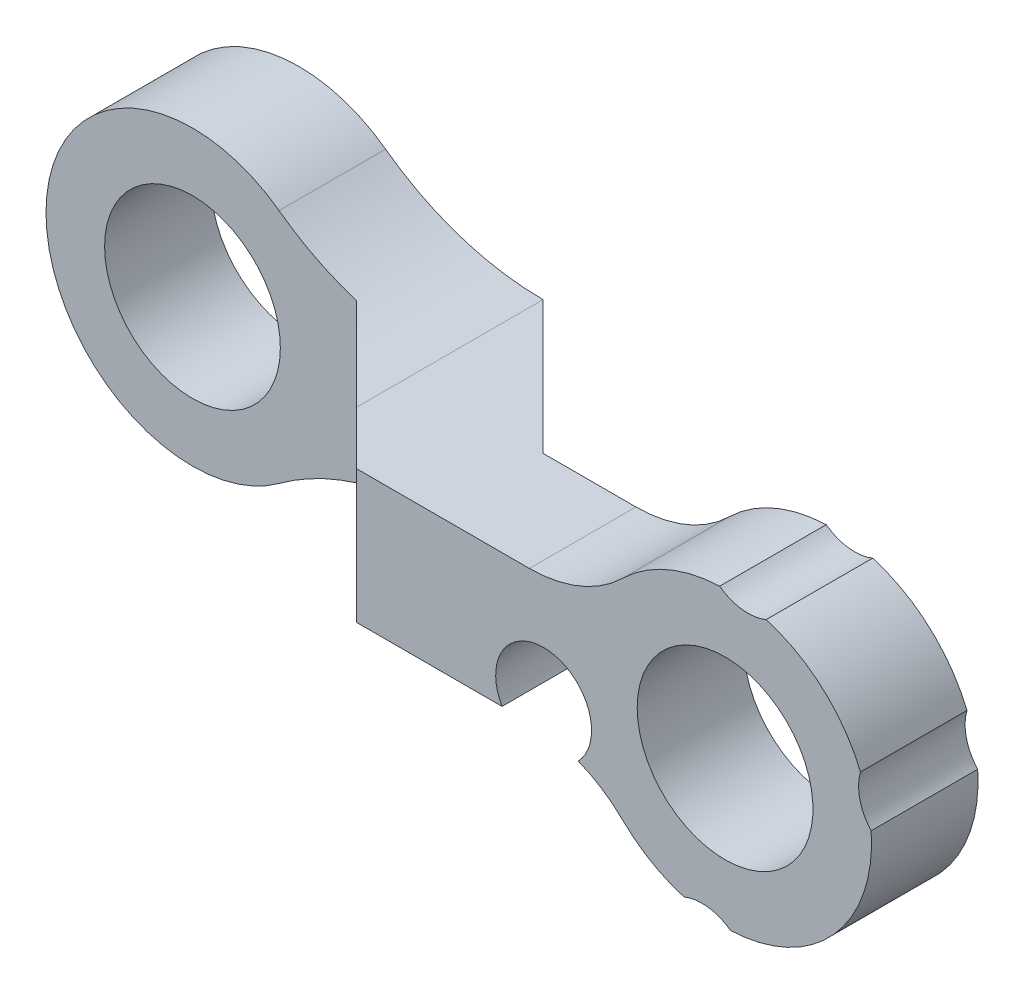
ISO-10303-21;
HEADER;
FILE_DESCRIPTION(('STEP AP214'),'2;1');
FILE_NAME('part.step','',(''),(''),'','','');
FILE_SCHEMA(('AUTOMOTIVE_DESIGN { 1 0 10303 214 1 1 1 1 }'));
ENDSEC;
DATA;
#1=APPLICATION_CONTEXT('core data for automotive mechanical design processes');
#2=APPLICATION_PROTOCOL_DEFINITION('international standard','automotive_design',2000,#1);
#3=PRODUCT_CONTEXT('',#1,'mechanical');
#4=PRODUCT('Part','Part','',(#3));
#5=PRODUCT_RELATED_PRODUCT_CATEGORY('part','',(#4));
#6=PRODUCT_DEFINITION_FORMATION('','',#4);
#7=PRODUCT_DEFINITION_CONTEXT('part definition',#1,'design');
#8=PRODUCT_DEFINITION('design','',#6,#7);
#9=PRODUCT_DEFINITION_SHAPE('','',#8);
#10=(LENGTH_UNIT() NAMED_UNIT(*) SI_UNIT(.MILLI.,.METRE.));
#11=(NAMED_UNIT(*) PLANE_ANGLE_UNIT() SI_UNIT($,.RADIAN.));
#12=(NAMED_UNIT(*) SI_UNIT($,.STERADIAN.) SOLID_ANGLE_UNIT());
#13=UNCERTAINTY_MEASURE_WITH_UNIT(LENGTH_MEASURE(1.E-05),#10,'distance_accuracy_value','');
#14=(GEOMETRIC_REPRESENTATION_CONTEXT(3) GLOBAL_UNCERTAINTY_ASSIGNED_CONTEXT((#13)) GLOBAL_UNIT_ASSIGNED_CONTEXT((#10,
#11,#12)) REPRESENTATION_CONTEXT('',''));
#15=CARTESIAN_POINT('',(0.,0.,0.));
#16=DIRECTION('',(0.,0.,1.));
#17=DIRECTION('',(1.,0.,0.));
#18=AXIS2_PLACEMENT_3D('',#15,#16,#17);
#19=CARTESIAN_POINT('',(0.,0.,4.));
#20=DIRECTION('',(0.,0.,-1.));
#21=DIRECTION('',(-1.,0.,0.));
#22=AXIS2_PLACEMENT_3D('',#19,#20,#21);
#23=CYLINDRICAL_SURFACE('',#22,5.5);
#24=DIRECTION('',(0.,0.,1.));
#25=VECTOR('',#24,1.);
#26=CARTESIAN_POINT('',(-1.54183676094759,-5.27946393136563,-1.));
#27=LINE('',#26,#25);
#28=CARTESIAN_POINT('',(-1.54183676094759,-5.27946393136563,4.));
#29=VERTEX_POINT('',#28);
#30=CARTESIAN_POINT('',(-1.54183676094759,-5.27946393136563,0.));
#31=VERTEX_POINT('',#30);
#32=EDGE_CURVE('E12',#29,#31,#27,.F.);
#33=ORIENTED_EDGE('',*,*,#32,.F.);
#34=CARTESIAN_POINT('',(0.,0.,4.));
#35=DIRECTION('',(0.,0.,-1.));
#36=DIRECTION('',(-1.,0.,0.));
#37=AXIS2_PLACEMENT_3D('',#34,#35,#36);
#38=CIRCLE('',#37,5.5);
#39=CARTESIAN_POINT('',(-3.84919816723071,-3.92857142857143,4.));
#40=VERTEX_POINT('',#39);
#41=EDGE_CURVE('E272',#29,#40,#38,.T.);
#42=ORIENTED_EDGE('',*,*,#41,.T.);
#43=DIRECTION('',(0.,0.,-1.));
#44=VECTOR('',#43,1.);
#45=CARTESIAN_POINT('',(-3.84919816723071,-3.92857142857143,4.));
#46=LINE('',#45,#44);
#47=CARTESIAN_POINT('',(-3.84919816723071,-3.92857142857143,0.));
#48=VERTEX_POINT('',#47);
#49=EDGE_CURVE('E238',#40,#48,#46,.T.);
#50=ORIENTED_EDGE('',*,*,#49,.T.);
#51=CARTESIAN_POINT('',(0.,0.,0.));
#52=DIRECTION('',(0.,0.,-1.));
#53=DIRECTION('',(-1.,0.,0.));
#54=AXIS2_PLACEMENT_3D('',#51,#52,#53);
#55=CIRCLE('',#54,5.5);
#56=EDGE_CURVE('E291',#31,#48,#55,.T.);
#57=ORIENTED_EDGE('',*,*,#56,.F.);
#58=EDGE_LOOP('',(#33,#42,#50,#57));
#59=FACE_BOUND('',#58,.T.);
#60=ADVANCED_FACE('F47',(#59),#23,.T.);
#61=DIRECTION('',(0.,0.,1.));
#62=VECTOR('',#61,1.);
#63=CARTESIAN_POINT('',(0.202992499598877,-5.49625272755053,-1.));
#64=LINE('',#63,#62);
#65=CARTESIAN_POINT('',(0.202992499598876,-5.49625272755053,0.));
#66=VERTEX_POINT('',#65);
#67=CARTESIAN_POINT('',(0.202992499598875,-5.49625272755053,4.));
#68=VERTEX_POINT('',#67);
#69=EDGE_CURVE('E55',#66,#68,#64,.T.);
#70=ORIENTED_EDGE('',*,*,#69,.F.);
#71=CARTESIAN_POINT('',(5.48635836046212,0.387132975329421,0.));
#72=VERTEX_POINT('',#71);
#73=EDGE_CURVE('E395',#72,#66,#55,.T.);
#74=ORIENTED_EDGE('',*,*,#73,.F.);
#75=DIRECTION('',(0.,0.,1.));
#76=VECTOR('',#75,1.);
#77=CARTESIAN_POINT('',(5.48635836046212,0.38713297532942,-1.));
#78=LINE('',#77,#76);
#79=CARTESIAN_POINT('',(5.48635836046212,0.387132975329419,4.));
#80=VERTEX_POINT('',#79);
#81=EDGE_CURVE('E260',#80,#72,#78,.F.);
#82=ORIENTED_EDGE('',*,*,#81,.F.);
#83=EDGE_CURVE('E271',#80,#68,#38,.T.);
#84=ORIENTED_EDGE('',*,*,#83,.T.);
#85=EDGE_LOOP('',(#70,#74,#82,#84));
#86=FACE_BOUND('',#85,.T.);
#87=ADVANCED_FACE('F276',(#86),#23,.T.);
#88=DIRECTION('',(0.,0.,1.));
#89=VECTOR('',#88,1.);
#90=CARTESIAN_POINT('',(5.08384879006289,2.09868565530336,-1.));
#91=LINE('',#90,#89);
#92=CARTESIAN_POINT('',(5.08384879006289,2.09868565530336,0.));
#93=VERTEX_POINT('',#92);
#94=CARTESIAN_POINT('',(5.08384879006289,2.09868565530336,4.));
#95=VERTEX_POINT('',#94);
#96=EDGE_CURVE('E258',#93,#95,#91,.T.);
#97=ORIENTED_EDGE('',*,*,#96,.F.);
#98=CARTESIAN_POINT('',(1.54183676094802,5.27946393136551,0.));
#99=VERTEX_POINT('',#98);
#100=EDGE_CURVE('E290',#99,#93,#55,.T.);
#101=ORIENTED_EDGE('',*,*,#100,.F.);
#102=DIRECTION('',(0.,0.,1.));
#103=VECTOR('',#102,1.);
#104=CARTESIAN_POINT('',(1.54183676094802,5.27946393136551,-1.));
#105=LINE('',#104,#103);
#106=CARTESIAN_POINT('',(1.54183676094802,5.27946393136551,4.));
#107=VERTEX_POINT('',#106);
#108=EDGE_CURVE('E256',#107,#99,#105,.F.);
#109=ORIENTED_EDGE('',*,*,#108,.F.);
#110=EDGE_CURVE('E277',#107,#95,#38,.T.);
#111=ORIENTED_EDGE('',*,*,#110,.T.);
#112=EDGE_LOOP('',(#97,#101,#109,#111));
#113=FACE_BOUND('',#112,.T.);
#114=ADVANCED_FACE('F368',(#113),#23,.T.);
#115=CARTESIAN_POINT('',(0.,0.,0.));
#116=DIRECTION('',(0.,0.,1.));
#117=DIRECTION('',(1.,0.,0.));
#118=AXIS2_PLACEMENT_3D('',#115,#116,#117);
#119=PLANE('',#118);
#120=CARTESIAN_POINT('',(-7.34846922834953,-7.5,0.));
#121=DIRECTION('',(0.,0.,1.));
#122=DIRECTION('',(1.,0.,0.));
#123=AXIS2_PLACEMENT_3D('',#120,#121,#122);
#124=CIRCLE('',#123,5.);
#125=CARTESIAN_POINT('',(-5.51491663862002,-2.84832450608427,0.));
#126=VERTEX_POINT('',#125);
#127=EDGE_CURVE('E244',#48,#126,#124,.T.);
#128=ORIENTED_EDGE('',*,*,#127,.T.);
#129=CARTESIAN_POINT('',(-6.81410538580853,-1.60248800028636,0.));
#130=DIRECTION('',(0.,0.,1.));
#131=DIRECTION('',(1.,0.,0.));
#132=AXIS2_PLACEMENT_3D('',#129,#130,#131);
#133=CIRCLE('',#132,1.8);
#134=CARTESIAN_POINT('',(-8.37438491537047,-2.5,0.));
#135=VERTEX_POINT('',#134);
#136=EDGE_CURVE('E181',#126,#135,#133,.T.);
#137=ORIENTED_EDGE('',*,*,#136,.T.);
#138=DIRECTION('',(-1.,0.,0.));
#139=VECTOR('',#138,1.);
#140=CARTESIAN_POINT('',(0.,-2.5,0.));
#141=LINE('',#140,#139);
#142=CARTESIAN_POINT('',(-10.8348486100883,-2.5,0.));
#143=VERTEX_POINT('',#142);
#144=EDGE_CURVE('E190',#135,#143,#141,.T.);
#145=ORIENTED_EDGE('',*,*,#144,.T.);
#146=DIRECTION('',(0.,1.,0.));
#147=VECTOR('',#146,1.);
#148=CARTESIAN_POINT('',(-10.8348486100883,2.50000000000003,0.));
#149=LINE('',#148,#147);
#150=CARTESIAN_POINT('',(-10.8348486100883,2.5,0.));
#151=VERTEX_POINT('',#150);
#152=EDGE_CURVE('E218',#143,#151,#149,.T.);
#153=ORIENTED_EDGE('',*,*,#152,.T.);
#154=DIRECTION('',(-1.,0.,0.));
#155=VECTOR('',#154,1.);
#156=CARTESIAN_POINT('',(0.,2.5,0.));
#157=LINE('',#156,#155);
#158=CARTESIAN_POINT('',(-7.34846922834953,2.5,0.));
#159=VERTEX_POINT('',#158);
#160=EDGE_CURVE('E199',#159,#151,#157,.T.);
#161=ORIENTED_EDGE('',*,*,#160,.F.);
#162=CARTESIAN_POINT('',(-7.34846922834953,7.5,0.));
#163=DIRECTION('',(0.,0.,1.));
#164=DIRECTION('',(1.,0.,0.));
#165=AXIS2_PLACEMENT_3D('',#162,#163,#164);
#166=CIRCLE('',#165,5.);
#167=CARTESIAN_POINT('',(-3.84919816723071,3.92857142857143,0.));
#168=VERTEX_POINT('',#167);
#169=EDGE_CURVE('E249',#159,#168,#166,.T.);
#170=ORIENTED_EDGE('',*,*,#169,.T.);
#171=CARTESIAN_POINT('',(-0.20299249959948,5.4962527275505,0.));
#172=VERTEX_POINT('',#171);
#173=EDGE_CURVE('E281',#168,#172,#55,.T.);
#174=ORIENTED_EDGE('',*,*,#173,.T.);
#175=CARTESIAN_POINT('',(0.86308865683564,6.94658750541869,0.));
#176=DIRECTION('',(0.,0.,1.));
#177=DIRECTION('',(1.,0.,0.));
#178=AXIS2_PLACEMENT_3D('',#175,#176,#177);
#179=CIRCLE('',#178,1.8);
#180=EDGE_CURVE('E191',#172,#99,#179,.T.);
#181=ORIENTED_EDGE('',*,*,#180,.T.);
#182=ORIENTED_EDGE('',*,*,#100,.T.);
#183=CARTESIAN_POINT('',(6.81410538581569,1.60248800027675,0.));
#184=DIRECTION('',(0.,0.,1.));
#185=DIRECTION('',(1.,0.,0.));
#186=AXIS2_PLACEMENT_3D('',#183,#184,#185);
#187=CIRCLE('',#186,1.8);
#188=EDGE_CURVE('E69',#93,#72,#187,.T.);
#189=ORIENTED_EDGE('',*,*,#188,.T.);
#190=ORIENTED_EDGE('',*,*,#73,.T.);
#191=CARTESIAN_POINT('',(-0.86308865683579,-6.94658750541905,0.));
#192=DIRECTION('',(0.,0.,1.));
#193=DIRECTION('',(1.,0.,0.));
#194=AXIS2_PLACEMENT_3D('',#191,#192,#193);
#195=CIRCLE('',#194,1.8);
#196=EDGE_CURVE('E61',#66,#31,#195,.T.);
#197=ORIENTED_EDGE('',*,*,#196,.T.);
#198=ORIENTED_EDGE('',*,*,#56,.T.);
#199=EDGE_LOOP('',(#128,#137,#145,#153,#161,#170,#174,#181,#182,#189,#190,#197,#198));
#200=FACE_BOUND('',#199,.T.);
#201=CARTESIAN_POINT('',(0.,0.,0.));
#202=DIRECTION('',(0.,0.,-1.));
#203=DIRECTION('',(-1.,0.,0.));
#204=AXIS2_PLACEMENT_3D('',#201,#202,#203);
#205=CIRCLE('',#204,3.3);
#206=CARTESIAN_POINT('',(-3.3,0.,0.));
#207=VERTEX_POINT('',#206);
#208=EDGE_CURVE('E286',#207,#207,#205,.T.);
#209=ORIENTED_EDGE('',*,*,#208,.F.);
#210=EDGE_LOOP('',(#209));
#211=FACE_BOUND('',#210,.T.);
#212=ADVANCED_FACE('F382',(#200,#211),#119,.F.);
#213=CARTESIAN_POINT('',(-25.,0.,4.));
#214=DIRECTION('',(0.,0.,-1.));
#215=DIRECTION('',(-1.,0.,0.));
#216=AXIS2_PLACEMENT_3D('',#213,#214,#215);
#217=CYLINDRICAL_SURFACE('',#216,5.5);
#218=DIRECTION('',(0.,0.,-1.));
#219=VECTOR('',#218,1.);
#220=CARTESIAN_POINT('',(-21.7478495068055,-4.43548387096774,4.));
#221=LINE('',#220,#219);
#222=CARTESIAN_POINT('',(-21.7478495068055,-4.43548387096774,-5.));
#223=VERTEX_POINT('',#222);
#224=CARTESIAN_POINT('',(-21.7478495068055,-4.43548387096774,-1.));
#225=VERTEX_POINT('',#224);
#226=EDGE_CURVE('E201',#223,#225,#221,.F.);
#227=ORIENTED_EDGE('',*,*,#226,.T.);
#228=CARTESIAN_POINT('',(-25.,0.,-1.));
#229=DIRECTION('',(0.,0.,1.));
#230=DIRECTION('',(-1.,0.,0.));
#231=AXIS2_PLACEMENT_3D('',#228,#229,#230);
#232=CIRCLE('',#231,5.5);
#233=CARTESIAN_POINT('',(-21.7478495068055,4.43548387096774,-1.));
#234=VERTEX_POINT('',#233);
#235=EDGE_CURVE('E294',#234,#225,#232,.T.);
#236=ORIENTED_EDGE('',*,*,#235,.F.);
#237=DIRECTION('',(0.,0.,-1.));
#238=VECTOR('',#237,1.);
#239=CARTESIAN_POINT('',(-21.7478495068055,4.43548387096774,4.));
#240=LINE('',#239,#238);
#241=CARTESIAN_POINT('',(-21.7478495068055,4.43548387096774,-5.));
#242=VERTEX_POINT('',#241);
#243=EDGE_CURVE('E211',#234,#242,#240,.T.);
#244=ORIENTED_EDGE('',*,*,#243,.T.);
#245=CARTESIAN_POINT('',(-25.,0.,-5.));
#246=DIRECTION('',(0.,0.,-1.));
#247=DIRECTION('',(1.,0.,0.));
#248=AXIS2_PLACEMENT_3D('',#245,#246,#247);
#249=CIRCLE('',#248,5.5);
#250=EDGE_CURVE('E307',#223,#242,#249,.T.);
#251=ORIENTED_EDGE('',*,*,#250,.F.);
#252=EDGE_LOOP('',(#227,#236,#244,#251));
#253=FACE_BOUND('',#252,.T.);
#254=ADVANCED_FACE('F324',(#253),#217,.T.);
#255=CARTESIAN_POINT('',(0.,-2.5,4.));
#256=DIRECTION('',(0.,-1.,0.));
#257=DIRECTION('',(1.,0.,0.));
#258=AXIS2_PLACEMENT_3D('',#255,#256,#257);
#259=PLANE('',#258);
#260=DIRECTION('',(0.,0.,1.));
#261=VECTOR('',#260,1.);
#262=CARTESIAN_POINT('',(-8.37438491537047,-2.5,-6.));
#263=LINE('',#262,#261);
#264=CARTESIAN_POINT('',(-8.37438491537047,-2.5,4.));
#265=VERTEX_POINT('',#264);
#266=EDGE_CURVE('E173',#265,#135,#263,.F.);
#267=ORIENTED_EDGE('',*,*,#266,.F.);
#268=DIRECTION('',(-1.,0.,0.));
#269=VECTOR('',#268,1.);
#270=CARTESIAN_POINT('',(0.,-2.5,4.));
#271=LINE('',#270,#269);
#272=CARTESIAN_POINT('',(-13.8348486100883,-2.5,4.));
#273=VERTEX_POINT('',#272);
#274=EDGE_CURVE('E187',#265,#273,#271,.T.);
#275=ORIENTED_EDGE('',*,*,#274,.T.);
#276=DIRECTION('',(-0.707106781186549,0.,-0.707106781186546));
#277=VECTOR('',#276,1.);
#278=CARTESIAN_POINT('',(-6.91742430504413,-2.5,10.9174243050442));
#279=LINE('',#278,#277);
#280=CARTESIAN_POINT('',(-15.8348486100883,-2.5,1.99999999999999));
#281=VERTEX_POINT('',#280);
#282=EDGE_CURVE('E232',#273,#281,#279,.T.);
#283=ORIENTED_EDGE('',*,*,#282,.T.);
#284=DIRECTION('',(0.,0.,-1.));
#285=VECTOR('',#284,1.);
#286=CARTESIAN_POINT('',(-15.8348486100883,-2.5,4.));
#287=LINE('',#286,#285);
#288=CARTESIAN_POINT('',(-15.8348486100883,-2.5,-5.));
#289=VERTEX_POINT('',#288);
#290=EDGE_CURVE('E216',#281,#289,#287,.T.);
#291=ORIENTED_EDGE('',*,*,#290,.T.);
#292=DIRECTION('',(-0.707106781186546,0.,-0.707106781186549));
#293=VECTOR('',#292,1.);
#294=CARTESIAN_POINT('',(-15.8348486100883,-2.5,-5.00000000000002));
#295=LINE('',#294,#293);
#296=EDGE_CURVE('E221',#289,#143,#295,.F.);
#297=ORIENTED_EDGE('',*,*,#296,.T.);
#298=ORIENTED_EDGE('',*,*,#144,.F.);
#299=EDGE_LOOP('',(#267,#275,#283,#291,#297,#298));
#300=FACE_BOUND('',#299,.T.);
#301=ADVANCED_FACE('F186',(#300),#259,.T.);
#302=CARTESIAN_POINT('',(0.,2.5,4.));
#303=DIRECTION('',(0.,-1.,0.));
#304=DIRECTION('',(1.,0.,0.));
#305=AXIS2_PLACEMENT_3D('',#302,#303,#304);
#306=PLANE('',#305);
#307=DIRECTION('',(-1.,0.,0.));
#308=VECTOR('',#307,1.);
#309=CARTESIAN_POINT('',(0.,2.5,4.));
#310=LINE('',#309,#308);
#311=CARTESIAN_POINT('',(-7.34846922834953,2.5,4.));
#312=VERTEX_POINT('',#311);
#313=CARTESIAN_POINT('',(-13.8348486100883,2.5,4.));
#314=VERTEX_POINT('',#313);
#315=EDGE_CURVE('E198',#312,#314,#310,.T.);
#316=ORIENTED_EDGE('',*,*,#315,.F.);
#317=DIRECTION('',(0.,0.,-1.));
#318=VECTOR('',#317,1.);
#319=CARTESIAN_POINT('',(-7.34846922834953,2.5,4.));
#320=LINE('',#319,#318);
#321=EDGE_CURVE('E241',#312,#159,#320,.T.);
#322=ORIENTED_EDGE('',*,*,#321,.T.);
#323=ORIENTED_EDGE('',*,*,#160,.T.);
#324=DIRECTION('',(0.707106781186546,0.,0.707106781186549));
#325=VECTOR('',#324,1.);
#326=CARTESIAN_POINT('',(-3.41742430504419,2.5,7.41742430504418));
#327=LINE('',#326,#325);
#328=CARTESIAN_POINT('',(-15.8348486100883,2.5,-5.));
#329=VERTEX_POINT('',#328);
#330=EDGE_CURVE('E223',#151,#329,#327,.F.);
#331=ORIENTED_EDGE('',*,*,#330,.T.);
#332=DIRECTION('',(0.,0.,1.));
#333=VECTOR('',#332,1.);
#334=CARTESIAN_POINT('',(-15.8348486100883,2.5,4.));
#335=LINE('',#334,#333);
#336=CARTESIAN_POINT('',(-15.8348486100883,2.5,1.99999999999999));
#337=VERTEX_POINT('',#336);
#338=EDGE_CURVE('E213',#329,#337,#335,.T.);
#339=ORIENTED_EDGE('',*,*,#338,.T.);
#340=DIRECTION('',(0.707106781186549,0.,0.707106781186546));
#341=VECTOR('',#340,1.);
#342=CARTESIAN_POINT('',(-18.8348486100883,2.5,-1.));
#343=LINE('',#342,#341);
#344=EDGE_CURVE('E228',#337,#314,#343,.T.);
#345=ORIENTED_EDGE('',*,*,#344,.T.);
#346=EDGE_LOOP('',(#316,#322,#323,#331,#339,#345));
#347=FACE_BOUND('',#346,.T.);
#348=ADVANCED_FACE('F334',(#347),#306,.F.);
#349=CARTESIAN_POINT('',(-25.,0.,4.));
#350=DIRECTION('',(0.,0.,-1.));
#351=DIRECTION('',(-1.,0.,0.));
#352=AXIS2_PLACEMENT_3D('',#349,#350,#351);
#353=CYLINDRICAL_SURFACE('',#352,3.3);
#354=CARTESIAN_POINT('',(-25.,0.,-1.));
#355=DIRECTION('',(0.,0.,1.));
#356=DIRECTION('',(1.,0.,0.));
#357=AXIS2_PLACEMENT_3D('',#354,#355,#356);
#358=CIRCLE('',#357,3.3);
#359=CARTESIAN_POINT('',(-21.7,0.,-1.));
#360=VERTEX_POINT('',#359);
#361=EDGE_CURVE('E285',#360,#360,#358,.T.);
#362=ORIENTED_EDGE('',*,*,#361,.T.);
#363=EDGE_LOOP('',(#362));
#364=FACE_BOUND('',#363,.T.);
#365=CARTESIAN_POINT('',(-25.,0.,-5.));
#366=DIRECTION('',(0.,0.,-1.));
#367=DIRECTION('',(-1.,0.,0.));
#368=AXIS2_PLACEMENT_3D('',#365,#366,#367);
#369=CIRCLE('',#368,3.3);
#370=CARTESIAN_POINT('',(-28.3,0.,-5.));
#371=VERTEX_POINT('',#370);
#372=EDGE_CURVE('E304',#371,#371,#369,.T.);
#373=ORIENTED_EDGE('',*,*,#372,.T.);
#374=EDGE_LOOP('',(#373));
#375=FACE_BOUND('',#374,.T.);
#376=ADVANCED_FACE('F435',(#364,#375),#353,.F.);
#377=CARTESIAN_POINT('',(0.,0.,4.));
#378=DIRECTION('',(0.,0.,1.));
#379=DIRECTION('',(1.,0.,0.));
#380=AXIS2_PLACEMENT_3D('',#377,#378,#379);
#381=PLANE('',#380);
#382=CARTESIAN_POINT('',(-6.81410538580853,-1.60248800028636,4.));
#383=DIRECTION('',(0.,0.,1.));
#384=DIRECTION('',(1.,0.,0.));
#385=AXIS2_PLACEMENT_3D('',#382,#383,#384);
#386=CIRCLE('',#385,1.8);
#387=CARTESIAN_POINT('',(-5.51491663862002,-2.84832450608427,4.));
#388=VERTEX_POINT('',#387);
#389=EDGE_CURVE('E170',#388,#265,#386,.T.);
#390=ORIENTED_EDGE('',*,*,#389,.F.);
#391=CARTESIAN_POINT('',(-7.34846922834953,-7.5,4.));
#392=DIRECTION('',(0.,0.,1.));
#393=DIRECTION('',(1.,0.,0.));
#394=AXIS2_PLACEMENT_3D('',#391,#392,#393);
#395=CIRCLE('',#394,5.);
#396=EDGE_CURVE('E247',#388,#40,#395,.F.);
#397=ORIENTED_EDGE('',*,*,#396,.T.);
#398=ORIENTED_EDGE('',*,*,#41,.F.);
#399=CARTESIAN_POINT('',(-0.86308865683579,-6.94658750541905,4.));
#400=DIRECTION('',(0.,0.,1.));
#401=DIRECTION('',(1.,0.,0.));
#402=AXIS2_PLACEMENT_3D('',#399,#400,#401);
#403=CIRCLE('',#402,1.8);
#404=EDGE_CURVE('E182',#68,#29,#403,.T.);
#405=ORIENTED_EDGE('',*,*,#404,.F.);
#406=ORIENTED_EDGE('',*,*,#83,.F.);
#407=CARTESIAN_POINT('',(6.81410538581569,1.60248800027675,4.));
#408=DIRECTION('',(0.,0.,1.));
#409=DIRECTION('',(1.,0.,0.));
#410=AXIS2_PLACEMENT_3D('',#407,#408,#409);
#411=CIRCLE('',#410,1.8);
#412=EDGE_CURVE('E273',#95,#80,#411,.T.);
#413=ORIENTED_EDGE('',*,*,#412,.F.);
#414=ORIENTED_EDGE('',*,*,#110,.F.);
#415=CARTESIAN_POINT('',(0.86308865683564,6.94658750541869,4.));
#416=DIRECTION('',(0.,0.,1.));
#417=DIRECTION('',(1.,0.,0.));
#418=AXIS2_PLACEMENT_3D('',#415,#416,#417);
#419=CIRCLE('',#418,1.8);
#420=CARTESIAN_POINT('',(-0.202992499599481,5.4962527275505,4.));
#421=VERTEX_POINT('',#420);
#422=EDGE_CURVE('E407',#421,#107,#419,.T.);
#423=ORIENTED_EDGE('',*,*,#422,.F.);
#424=CARTESIAN_POINT('',(-3.84919816723071,3.92857142857143,4.));
#425=VERTEX_POINT('',#424);
#426=EDGE_CURVE('E280',#425,#421,#38,.T.);
#427=ORIENTED_EDGE('',*,*,#426,.F.);
#428=CARTESIAN_POINT('',(-7.34846922834953,7.5,4.));
#429=DIRECTION('',(0.,0.,1.));
#430=DIRECTION('',(1.,0.,0.));
#431=AXIS2_PLACEMENT_3D('',#428,#429,#430);
#432=CIRCLE('',#431,5.);
#433=EDGE_CURVE('E251',#425,#312,#432,.F.);
#434=ORIENTED_EDGE('',*,*,#433,.T.);
#435=ORIENTED_EDGE('',*,*,#315,.T.);
#436=DIRECTION('',(0.,-1.,0.));
#437=VECTOR('',#436,1.);
#438=CARTESIAN_POINT('',(-13.8348486100883,-2.96060798583055,4.));
#439=LINE('',#438,#437);
#440=EDGE_CURVE('E196',#314,#273,#439,.T.);
#441=ORIENTED_EDGE('',*,*,#440,.T.);
#442=ORIENTED_EDGE('',*,*,#274,.F.);
#443=EDGE_LOOP('',(#390,#397,#398,#405,#406,#413,#414,#423,#427,#434,#435,#441,#442));
#444=FACE_BOUND('',#443,.T.);
#445=CARTESIAN_POINT('',(0.,0.,4.));
#446=DIRECTION('',(0.,0.,-1.));
#447=DIRECTION('',(-1.,0.,0.));
#448=AXIS2_PLACEMENT_3D('',#445,#446,#447);
#449=CIRCLE('',#448,3.3);
#450=CARTESIAN_POINT('',(-3.3,0.,4.));
#451=VERTEX_POINT('',#450);
#452=EDGE_CURVE('E396',#451,#451,#449,.T.);
#453=ORIENTED_EDGE('',*,*,#452,.T.);
#454=EDGE_LOOP('',(#453));
#455=FACE_BOUND('',#454,.T.);
#456=ADVANCED_FACE('F193',(#444,#455),#381,.T.);
#457=CARTESIAN_POINT('',(-15.8348486100883,12.5,4.));
#458=DIRECTION('',(0.,0.,-1.));
#459=DIRECTION('',(-1.,0.,0.));
#460=AXIS2_PLACEMENT_3D('',#457,#458,#459);
#461=CYLINDRICAL_SURFACE('',#460,10.);
#462=CARTESIAN_POINT('',(-15.8348486100883,12.5,-1.));
#463=DIRECTION('',(0.,0.,-1.));
#464=DIRECTION('',(1.,0.,0.));
#465=AXIS2_PLACEMENT_3D('',#462,#463,#464);
#466=CIRCLE('',#465,10.);
#467=CARTESIAN_POINT('',(-18.8348486100883,2.96060798583054,-1.));
#468=VERTEX_POINT('',#467);
#469=EDGE_CURVE('E302',#468,#234,#466,.T.);
#470=ORIENTED_EDGE('',*,*,#469,.F.);
#471=CARTESIAN_POINT('',(-15.8348486100883,12.5,1.99999999999998));
#472=DIRECTION('',(-0.707106781186546,0.,0.707106781186549));
#473=DIRECTION('',(-0.707106781186549,0.,-0.707106781186546));
#474=AXIS2_PLACEMENT_3D('',#471,#472,#473);
#475=ELLIPSE('',#474,14.1421356237309,10.);
#476=EDGE_CURVE('E226',#468,#337,#475,.T.);
#477=ORIENTED_EDGE('',*,*,#476,.T.);
#478=ORIENTED_EDGE('',*,*,#338,.F.);
#479=CARTESIAN_POINT('',(-15.8348486100883,12.5,-5.));
#480=DIRECTION('',(0.,0.,1.));
#481=DIRECTION('',(1.,0.,0.));
#482=AXIS2_PLACEMENT_3D('',#479,#480,#481);
#483=CIRCLE('',#482,10.);
#484=EDGE_CURVE('E310',#242,#329,#483,.T.);
#485=ORIENTED_EDGE('',*,*,#484,.F.);
#486=ORIENTED_EDGE('',*,*,#243,.F.);
#487=EDGE_LOOP('',(#470,#477,#478,#485,#486));
#488=FACE_BOUND('',#487,.T.);
#489=ADVANCED_FACE('F330',(#488),#461,.F.);
#490=CARTESIAN_POINT('',(-15.8348486100883,-12.5,4.));
#491=DIRECTION('',(0.,0.,-1.));
#492=DIRECTION('',(-1.,0.,0.));
#493=AXIS2_PLACEMENT_3D('',#490,#491,#492);
#494=CYLINDRICAL_SURFACE('',#493,10.);
#495=ORIENTED_EDGE('',*,*,#290,.F.);
#496=CARTESIAN_POINT('',(-15.8348486100883,-12.5,2.));
#497=DIRECTION('',(-0.707106781186546,0.,0.707106781186549));
#498=DIRECTION('',(-0.707106781186549,0.,-0.707106781186546));
#499=AXIS2_PLACEMENT_3D('',#496,#497,#498);
#500=ELLIPSE('',#499,14.1421356237309,10.);
#501=CARTESIAN_POINT('',(-18.8348486100883,-2.96060798583055,-1.));
#502=VERTEX_POINT('',#501);
#503=EDGE_CURVE('E234',#281,#502,#500,.T.);
#504=ORIENTED_EDGE('',*,*,#503,.T.);
#505=CARTESIAN_POINT('',(-15.8348486100883,-12.5,-1.));
#506=DIRECTION('',(0.,0.,-1.));
#507=DIRECTION('',(-1.,0.,0.));
#508=AXIS2_PLACEMENT_3D('',#505,#506,#507);
#509=CIRCLE('',#508,10.);
#510=EDGE_CURVE('E296',#225,#502,#509,.T.);
#511=ORIENTED_EDGE('',*,*,#510,.F.);
#512=ORIENTED_EDGE('',*,*,#226,.F.);
#513=CARTESIAN_POINT('',(-15.8348486100883,-12.5,-5.));
#514=DIRECTION('',(0.,0.,1.));
#515=DIRECTION('',(-1.,0.,0.));
#516=AXIS2_PLACEMENT_3D('',#513,#514,#515);
#517=CIRCLE('',#516,10.);
#518=EDGE_CURVE('E205',#289,#223,#517,.T.);
#519=ORIENTED_EDGE('',*,*,#518,.F.);
#520=EDGE_LOOP('',(#495,#504,#511,#512,#519));
#521=FACE_BOUND('',#520,.T.);
#522=ADVANCED_FACE('F342',(#521),#494,.F.);
#523=CARTESIAN_POINT('',(-25.,0.,-5.));
#524=DIRECTION('',(0.,0.,1.));
#525=DIRECTION('',(1.,0.,0.));
#526=AXIS2_PLACEMENT_3D('',#523,#524,#525);
#527=PLANE('',#526);
#528=ORIENTED_EDGE('',*,*,#250,.T.);
#529=ORIENTED_EDGE('',*,*,#484,.T.);
#530=DIRECTION('',(0.,-1.,0.));
#531=VECTOR('',#530,1.);
#532=CARTESIAN_POINT('',(-15.8348486100883,2.5,-5.));
#533=LINE('',#532,#531);
#534=EDGE_CURVE('E312',#329,#289,#533,.T.);
#535=ORIENTED_EDGE('',*,*,#534,.T.);
#536=ORIENTED_EDGE('',*,*,#518,.T.);
#537=EDGE_LOOP('',(#528,#529,#535,#536));
#538=FACE_BOUND('',#537,.T.);
#539=ORIENTED_EDGE('',*,*,#372,.F.);
#540=EDGE_LOOP('',(#539));
#541=FACE_BOUND('',#540,.T.);
#542=ADVANCED_FACE('F319',(#538,#541),#527,.F.);
#543=CARTESIAN_POINT('',(-15.8348486100883,2.5,-5.));
#544=DIRECTION('',(0.707106781186549,0.,-0.707106781186546));
#545=DIRECTION('',(0.,1.,0.));
#546=AXIS2_PLACEMENT_3D('',#543,#544,#545);
#547=PLANE('',#546);
#548=ORIENTED_EDGE('',*,*,#330,.F.);
#549=ORIENTED_EDGE('',*,*,#152,.F.);
#550=ORIENTED_EDGE('',*,*,#296,.F.);
#551=ORIENTED_EDGE('',*,*,#534,.F.);
#552=EDGE_LOOP('',(#548,#549,#550,#551));
#553=FACE_BOUND('',#552,.T.);
#554=ADVANCED_FACE('F340',(#553),#547,.T.);
#555=CARTESIAN_POINT('',(-25.,0.,-1.));
#556=DIRECTION('',(0.,0.,-1.));
#557=DIRECTION('',(-1.,0.,0.));
#558=AXIS2_PLACEMENT_3D('',#555,#556,#557);
#559=PLANE('',#558);
#560=ORIENTED_EDGE('',*,*,#361,.F.);
#561=EDGE_LOOP('',(#560));
#562=FACE_BOUND('',#561,.T.);
#563=ORIENTED_EDGE('',*,*,#235,.T.);
#564=ORIENTED_EDGE('',*,*,#510,.T.);
#565=DIRECTION('',(0.,1.,0.));
#566=VECTOR('',#565,1.);
#567=CARTESIAN_POINT('',(-18.8348486100883,-2.96060798583055,-1.));
#568=LINE('',#567,#566);
#569=EDGE_CURVE('E299',#502,#468,#568,.T.);
#570=ORIENTED_EDGE('',*,*,#569,.T.);
#571=ORIENTED_EDGE('',*,*,#469,.T.);
#572=EDGE_LOOP('',(#563,#564,#570,#571));
#573=FACE_BOUND('',#572,.T.);
#574=ADVANCED_FACE('F348',(#562,#573),#559,.F.);
#575=CARTESIAN_POINT('',(-18.8348486100883,-2.96060798583055,-1.));
#576=DIRECTION('',(-0.707106781186546,0.,0.707106781186549));
#577=DIRECTION('',(0.,-1.,0.));
#578=AXIS2_PLACEMENT_3D('',#575,#576,#577);
#579=PLANE('',#578);
#580=ORIENTED_EDGE('',*,*,#282,.F.);
#581=ORIENTED_EDGE('',*,*,#440,.F.);
#582=ORIENTED_EDGE('',*,*,#344,.F.);
#583=ORIENTED_EDGE('',*,*,#476,.F.);
#584=ORIENTED_EDGE('',*,*,#569,.F.);
#585=ORIENTED_EDGE('',*,*,#503,.F.);
#586=EDGE_LOOP('',(#580,#581,#582,#583,#584,#585));
#587=FACE_BOUND('',#586,.T.);
#588=ADVANCED_FACE('F346',(#587),#579,.T.);
#589=DIRECTION('',(0.,0.,1.));
#590=VECTOR('',#589,1.);
#591=CARTESIAN_POINT('',(-0.202992499599481,5.4962527275505,-1.));
#592=LINE('',#591,#590);
#593=EDGE_CURVE('E254',#172,#421,#592,.T.);
#594=ORIENTED_EDGE('',*,*,#593,.F.);
#595=ORIENTED_EDGE('',*,*,#173,.F.);
#596=DIRECTION('',(0.,0.,-1.));
#597=VECTOR('',#596,1.);
#598=CARTESIAN_POINT('',(-3.84919816723071,3.92857142857143,4.));
#599=LINE('',#598,#597);
#600=EDGE_CURVE('E236',#168,#425,#599,.F.);
#601=ORIENTED_EDGE('',*,*,#600,.T.);
#602=ORIENTED_EDGE('',*,*,#426,.T.);
#603=EDGE_LOOP('',(#594,#595,#601,#602));
#604=FACE_BOUND('',#603,.T.);
#605=ADVANCED_FACE('F356',(#604),#23,.T.);
#606=CARTESIAN_POINT('',(0.,0.,4.));
#607=DIRECTION('',(0.,0.,-1.));
#608=DIRECTION('',(-1.,0.,0.));
#609=AXIS2_PLACEMENT_3D('',#606,#607,#608);
#610=CYLINDRICAL_SURFACE('',#609,3.3);
#611=ORIENTED_EDGE('',*,*,#208,.T.);
#612=EDGE_LOOP('',(#611));
#613=FACE_BOUND('',#612,.T.);
#614=ORIENTED_EDGE('',*,*,#452,.F.);
#615=EDGE_LOOP('',(#614));
#616=FACE_BOUND('',#615,.T.);
#617=ADVANCED_FACE('F371',(#613,#616),#610,.F.);
#618=CARTESIAN_POINT('',(-7.34846922834953,-7.5,4.));
#619=DIRECTION('',(0.,0.,-1.));
#620=DIRECTION('',(-1.,0.,0.));
#621=AXIS2_PLACEMENT_3D('',#618,#619,#620);
#622=CYLINDRICAL_SURFACE('',#621,5.);
#623=ORIENTED_EDGE('',*,*,#396,.F.);
#624=DIRECTION('',(0.,0.,1.));
#625=VECTOR('',#624,1.);
#626=CARTESIAN_POINT('',(-5.51491663862002,-2.84832450608427,-1.));
#627=LINE('',#626,#625);
#628=EDGE_CURVE('E176',#388,#126,#627,.F.);
#629=ORIENTED_EDGE('',*,*,#628,.T.);
#630=ORIENTED_EDGE('',*,*,#127,.F.);
#631=ORIENTED_EDGE('',*,*,#49,.F.);
#632=EDGE_LOOP('',(#623,#629,#630,#631));
#633=FACE_BOUND('',#632,.T.);
#634=ADVANCED_FACE('F378',(#633),#622,.F.);
#635=CARTESIAN_POINT('',(-7.34846922834953,7.5,4.));
#636=DIRECTION('',(0.,0.,-1.));
#637=DIRECTION('',(-1.,0.,0.));
#638=AXIS2_PLACEMENT_3D('',#635,#636,#637);
#639=CYLINDRICAL_SURFACE('',#638,5.);
#640=ORIENTED_EDGE('',*,*,#433,.F.);
#641=ORIENTED_EDGE('',*,*,#600,.F.);
#642=ORIENTED_EDGE('',*,*,#169,.F.);
#643=ORIENTED_EDGE('',*,*,#321,.F.);
#644=EDGE_LOOP('',(#640,#641,#642,#643));
#645=FACE_BOUND('',#644,.T.);
#646=ADVANCED_FACE('F49',(#645),#639,.F.);
#647=CARTESIAN_POINT('',(-6.81410538580853,-1.60248800028636,-6.));
#648=DIRECTION('',(0.,0.,1.));
#649=DIRECTION('',(1.,0.,0.));
#650=AXIS2_PLACEMENT_3D('',#647,#648,#649);
#651=CYLINDRICAL_SURFACE('',#650,1.8);
#652=ORIENTED_EDGE('',*,*,#266,.T.);
#653=ORIENTED_EDGE('',*,*,#136,.F.);
#654=ORIENTED_EDGE('',*,*,#628,.F.);
#655=ORIENTED_EDGE('',*,*,#389,.T.);
#656=EDGE_LOOP('',(#652,#653,#654,#655));
#657=FACE_BOUND('',#656,.T.);
#658=ADVANCED_FACE('F172',(#657),#651,.F.);
#659=CARTESIAN_POINT('',(0.86308865683564,6.94658750541869,-6.));
#660=DIRECTION('',(0.,0.,1.));
#661=DIRECTION('',(1.,0.,0.));
#662=AXIS2_PLACEMENT_3D('',#659,#660,#661);
#663=CYLINDRICAL_SURFACE('',#662,1.8);
#664=ORIENTED_EDGE('',*,*,#108,.T.);
#665=ORIENTED_EDGE('',*,*,#180,.F.);
#666=ORIENTED_EDGE('',*,*,#593,.T.);
#667=ORIENTED_EDGE('',*,*,#422,.T.);
#668=EDGE_LOOP('',(#664,#665,#666,#667));
#669=FACE_BOUND('',#668,.T.);
#670=ADVANCED_FACE('F534',(#669),#663,.F.);
#671=CARTESIAN_POINT('',(6.81410538581569,1.60248800027675,-6.));
#672=DIRECTION('',(0.,0.,1.));
#673=DIRECTION('',(1.,0.,0.));
#674=AXIS2_PLACEMENT_3D('',#671,#672,#673);
#675=CYLINDRICAL_SURFACE('',#674,1.8);
#676=ORIENTED_EDGE('',*,*,#81,.T.);
#677=ORIENTED_EDGE('',*,*,#188,.F.);
#678=ORIENTED_EDGE('',*,*,#96,.T.);
#679=ORIENTED_EDGE('',*,*,#412,.T.);
#680=EDGE_LOOP('',(#676,#677,#678,#679));
#681=FACE_BOUND('',#680,.T.);
#682=ADVANCED_FACE('F409',(#681),#675,.F.);
#683=CARTESIAN_POINT('',(-0.86308865683579,-6.94658750541905,-6.));
#684=DIRECTION('',(0.,0.,1.));
#685=DIRECTION('',(1.,0.,0.));
#686=AXIS2_PLACEMENT_3D('',#683,#684,#685);
#687=CYLINDRICAL_SURFACE('',#686,1.8);
#688=ORIENTED_EDGE('',*,*,#32,.T.);
#689=ORIENTED_EDGE('',*,*,#196,.F.);
#690=ORIENTED_EDGE('',*,*,#69,.T.);
#691=ORIENTED_EDGE('',*,*,#404,.T.);
#692=EDGE_LOOP('',(#688,#689,#690,#691));
#693=FACE_BOUND('',#692,.T.);
#694=ADVANCED_FACE('F262',(#693),#687,.F.);
#695=CLOSED_SHELL('',(#60,#87,#114,#212,#254,#301,#348,#376,#456,#489,#522,#542,#554,#574,#588,
#605,#617,#634,#646,#658,#670,#682,#694));
#696=MANIFOLD_SOLID_BREP('B2',#695);
#697=ADVANCED_BREP_SHAPE_REPRESENTATION('',(#18,#696),#14);
#698=SHAPE_DEFINITION_REPRESENTATION(#9,#697);
ENDSEC;
END-ISO-10303-21;
